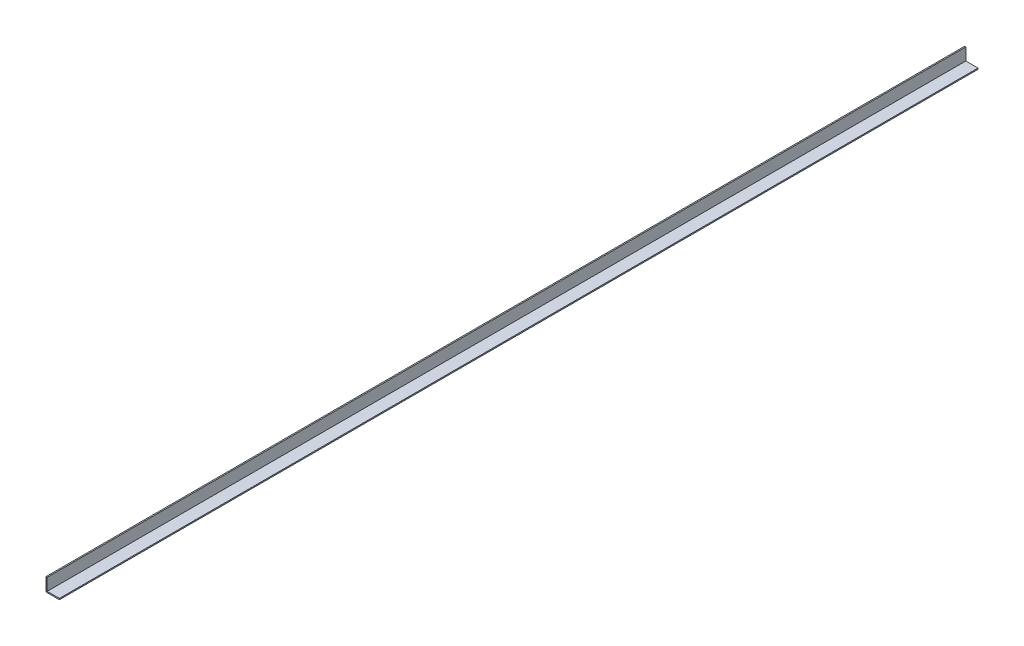
ISO-10303-21;
HEADER;
FILE_DESCRIPTION(('STEP AP214'),'2;1');
FILE_NAME('part.step','',(''),(''),'','','');
FILE_SCHEMA(('AUTOMOTIVE_DESIGN { 1 0 10303 214 1 1 1 1 }'));
ENDSEC;
DATA;
#1=APPLICATION_CONTEXT('core data for automotive mechanical design processes');
#2=APPLICATION_PROTOCOL_DEFINITION('international standard','automotive_design',2000,#1);
#3=PRODUCT_CONTEXT('',#1,'mechanical');
#4=PRODUCT('Part','Part','',(#3));
#5=PRODUCT_RELATED_PRODUCT_CATEGORY('part','',(#4));
#6=PRODUCT_DEFINITION_FORMATION('','',#4);
#7=PRODUCT_DEFINITION_CONTEXT('part definition',#1,'design');
#8=PRODUCT_DEFINITION('design','',#6,#7);
#9=PRODUCT_DEFINITION_SHAPE('','',#8);
#10=(LENGTH_UNIT() NAMED_UNIT(*) SI_UNIT(.MILLI.,.METRE.));
#11=(NAMED_UNIT(*) PLANE_ANGLE_UNIT() SI_UNIT($,.RADIAN.));
#12=(NAMED_UNIT(*) SI_UNIT($,.STERADIAN.) SOLID_ANGLE_UNIT());
#13=UNCERTAINTY_MEASURE_WITH_UNIT(LENGTH_MEASURE(1.E-05),#10,'distance_accuracy_value','');
#14=(GEOMETRIC_REPRESENTATION_CONTEXT(3) GLOBAL_UNCERTAINTY_ASSIGNED_CONTEXT((#13)) GLOBAL_UNIT_ASSIGNED_CONTEXT((#10,
#11,#12)) REPRESENTATION_CONTEXT('',''));
#15=CARTESIAN_POINT('',(0.,0.,0.));
#16=DIRECTION('',(0.,0.,1.));
#17=DIRECTION('',(1.,0.,0.));
#18=AXIS2_PLACEMENT_3D('',#15,#16,#17);
#19=CARTESIAN_POINT('',(7.94,88.9,-6100.));
#20=DIRECTION('',(0.,1.,0.));
#21=DIRECTION('',(0.,0.,1.));
#22=AXIS2_PLACEMENT_3D('',#19,#20,#21);
#23=PLANE('',#22);
#24=DIRECTION('',(-1.,0.,0.));
#25=VECTOR('',#24,1.);
#26=CARTESIAN_POINT('',(7.94,88.9,0.));
#27=LINE('',#26,#25);
#28=CARTESIAN_POINT('',(7.94,88.9,0.));
#29=VERTEX_POINT('',#28);
#30=CARTESIAN_POINT('',(0.,88.9,0.));
#31=VERTEX_POINT('',#30);
#32=EDGE_CURVE('E118',#29,#31,#27,.T.);
#33=ORIENTED_EDGE('',*,*,#32,.F.);
#34=DIRECTION('',(0.,0.,1.));
#35=VECTOR('',#34,1.);
#36=CARTESIAN_POINT('',(7.94,88.9,-6100.));
#37=LINE('',#36,#35);
#38=CARTESIAN_POINT('',(7.94,88.9,-6100.));
#39=VERTEX_POINT('',#38);
#40=EDGE_CURVE('E11',#39,#29,#37,.T.);
#41=ORIENTED_EDGE('',*,*,#40,.F.);
#42=DIRECTION('',(-1.,0.,0.));
#43=VECTOR('',#42,1.);
#44=CARTESIAN_POINT('',(7.94,88.9,-6100.));
#45=LINE('',#44,#43);
#46=CARTESIAN_POINT('',(0.,88.9,-6100.));
#47=VERTEX_POINT('',#46);
#48=EDGE_CURVE('E132',#39,#47,#45,.T.);
#49=ORIENTED_EDGE('',*,*,#48,.T.);
#50=DIRECTION('',(0.,0.,1.));
#51=VECTOR('',#50,1.);
#52=CARTESIAN_POINT('',(0.,88.9,-6100.));
#53=LINE('',#52,#51);
#54=EDGE_CURVE('E36',#47,#31,#53,.T.);
#55=ORIENTED_EDGE('',*,*,#54,.T.);
#56=EDGE_LOOP('',(#33,#41,#49,#55));
#57=FACE_BOUND('',#56,.T.);
#58=ADVANCED_FACE('F33',(#57),#23,.T.);
#59=CARTESIAN_POINT('',(7.94,7.94,-6100.));
#60=DIRECTION('',(1.,0.,0.));
#61=DIRECTION('',(0.,1.,0.));
#62=AXIS2_PLACEMENT_3D('',#59,#60,#61);
#63=PLANE('',#62);
#64=DIRECTION('',(0.,1.,0.));
#65=VECTOR('',#64,1.);
#66=CARTESIAN_POINT('',(7.94,7.94,0.));
#67=LINE('',#66,#65);
#68=CARTESIAN_POINT('',(7.94,7.94,0.));
#69=VERTEX_POINT('',#68);
#70=EDGE_CURVE('E130',#69,#29,#67,.T.);
#71=ORIENTED_EDGE('',*,*,#70,.F.);
#72=DIRECTION('',(0.,0.,1.));
#73=VECTOR('',#72,1.);
#74=CARTESIAN_POINT('',(7.94,7.94,-6100.));
#75=LINE('',#74,#73);
#76=CARTESIAN_POINT('',(7.94,7.94,-6100.));
#77=VERTEX_POINT('',#76);
#78=EDGE_CURVE('E42',#77,#69,#75,.T.);
#79=ORIENTED_EDGE('',*,*,#78,.F.);
#80=DIRECTION('',(0.,1.,0.));
#81=VECTOR('',#80,1.);
#82=CARTESIAN_POINT('',(7.94,7.94,-6100.));
#83=LINE('',#82,#81);
#84=EDGE_CURVE('E108',#77,#39,#83,.T.);
#85=ORIENTED_EDGE('',*,*,#84,.T.);
#86=ORIENTED_EDGE('',*,*,#40,.T.);
#87=EDGE_LOOP('',(#71,#79,#85,#86));
#88=FACE_BOUND('',#87,.T.);
#89=ADVANCED_FACE('F140',(#88),#63,.T.);
#90=CARTESIAN_POINT('',(88.9,7.94,-6100.));
#91=DIRECTION('',(0.,1.,0.));
#92=DIRECTION('',(-1.,0.,0.));
#93=AXIS2_PLACEMENT_3D('',#90,#91,#92);
#94=PLANE('',#93);
#95=DIRECTION('',(-1.,0.,0.));
#96=VECTOR('',#95,1.);
#97=CARTESIAN_POINT('',(88.9,7.94,0.));
#98=LINE('',#97,#96);
#99=CARTESIAN_POINT('',(88.9,7.94,0.));
#100=VERTEX_POINT('',#99);
#101=EDGE_CURVE('E95',#100,#69,#98,.T.);
#102=ORIENTED_EDGE('',*,*,#101,.F.);
#103=DIRECTION('',(0.,0.,1.));
#104=VECTOR('',#103,1.);
#105=CARTESIAN_POINT('',(88.9,7.94,-6100.));
#106=LINE('',#105,#104);
#107=CARTESIAN_POINT('',(88.9,7.94,-6100.));
#108=VERTEX_POINT('',#107);
#109=EDGE_CURVE('E90',#108,#100,#106,.T.);
#110=ORIENTED_EDGE('',*,*,#109,.F.);
#111=DIRECTION('',(-1.,0.,0.));
#112=VECTOR('',#111,1.);
#113=CARTESIAN_POINT('',(88.9,7.94,-6100.));
#114=LINE('',#113,#112);
#115=EDGE_CURVE('E93',#108,#77,#114,.T.);
#116=ORIENTED_EDGE('',*,*,#115,.T.);
#117=ORIENTED_EDGE('',*,*,#78,.T.);
#118=EDGE_LOOP('',(#102,#110,#116,#117));
#119=FACE_BOUND('',#118,.T.);
#120=ADVANCED_FACE('F92',(#119),#94,.T.);
#121=CARTESIAN_POINT('',(88.9,0.,-6100.));
#122=DIRECTION('',(1.,0.,0.));
#123=DIRECTION('',(0.,0.,-1.));
#124=AXIS2_PLACEMENT_3D('',#121,#122,#123);
#125=PLANE('',#124);
#126=DIRECTION('',(0.,1.,0.));
#127=VECTOR('',#126,1.);
#128=CARTESIAN_POINT('',(88.9,0.,0.));
#129=LINE('',#128,#127);
#130=CARTESIAN_POINT('',(88.9,0.,0.));
#131=VERTEX_POINT('',#130);
#132=EDGE_CURVE('E127',#131,#100,#129,.T.);
#133=ORIENTED_EDGE('',*,*,#132,.F.);
#134=DIRECTION('',(0.,0.,1.));
#135=VECTOR('',#134,1.);
#136=CARTESIAN_POINT('',(88.9,0.,-6100.));
#137=LINE('',#136,#135);
#138=CARTESIAN_POINT('',(88.9,0.,-6100.));
#139=VERTEX_POINT('',#138);
#140=EDGE_CURVE('E100',#139,#131,#137,.T.);
#141=ORIENTED_EDGE('',*,*,#140,.F.);
#142=DIRECTION('',(0.,1.,0.));
#143=VECTOR('',#142,1.);
#144=CARTESIAN_POINT('',(88.9,0.,-6100.));
#145=LINE('',#144,#143);
#146=EDGE_CURVE('E106',#139,#108,#145,.T.);
#147=ORIENTED_EDGE('',*,*,#146,.T.);
#148=ORIENTED_EDGE('',*,*,#109,.T.);
#149=EDGE_LOOP('',(#133,#141,#147,#148));
#150=FACE_BOUND('',#149,.T.);
#151=ADVANCED_FACE('F110',(#150),#125,.T.);
#152=CARTESIAN_POINT('',(0.,0.,-6100.));
#153=DIRECTION('',(0.,-1.,0.));
#154=DIRECTION('',(0.,0.,-1.));
#155=AXIS2_PLACEMENT_3D('',#152,#153,#154);
#156=PLANE('',#155);
#157=DIRECTION('',(1.,0.,0.));
#158=VECTOR('',#157,1.);
#159=CARTESIAN_POINT('',(0.,0.,0.));
#160=LINE('',#159,#158);
#161=CARTESIAN_POINT('',(0.,0.,0.));
#162=VERTEX_POINT('',#161);
#163=EDGE_CURVE('E124',#162,#131,#160,.T.);
#164=ORIENTED_EDGE('',*,*,#163,.F.);
#165=DIRECTION('',(0.,0.,1.));
#166=VECTOR('',#165,1.);
#167=CARTESIAN_POINT('',(0.,0.,-6100.));
#168=LINE('',#167,#166);
#169=CARTESIAN_POINT('',(0.,0.,-6100.));
#170=VERTEX_POINT('',#169);
#171=EDGE_CURVE('E135',#170,#162,#168,.T.);
#172=ORIENTED_EDGE('',*,*,#171,.F.);
#173=DIRECTION('',(1.,0.,0.));
#174=VECTOR('',#173,1.);
#175=CARTESIAN_POINT('',(0.,0.,-6100.));
#176=LINE('',#175,#174);
#177=EDGE_CURVE('E111',#170,#139,#176,.T.);
#178=ORIENTED_EDGE('',*,*,#177,.T.);
#179=ORIENTED_EDGE('',*,*,#140,.T.);
#180=EDGE_LOOP('',(#164,#172,#178,#179));
#181=FACE_BOUND('',#180,.T.);
#182=ADVANCED_FACE('F153',(#181),#156,.T.);
#183=CARTESIAN_POINT('',(0.,88.9,-6100.));
#184=DIRECTION('',(-1.,0.,0.));
#185=DIRECTION('',(0.,-1.,0.));
#186=AXIS2_PLACEMENT_3D('',#183,#184,#185);
#187=PLANE('',#186);
#188=DIRECTION('',(0.,-1.,0.));
#189=VECTOR('',#188,1.);
#190=CARTESIAN_POINT('',(0.,88.9,0.));
#191=LINE('',#190,#189);
#192=EDGE_CURVE('E121',#31,#162,#191,.T.);
#193=ORIENTED_EDGE('',*,*,#192,.F.);
#194=ORIENTED_EDGE('',*,*,#54,.F.);
#195=DIRECTION('',(0.,-1.,0.));
#196=VECTOR('',#195,1.);
#197=CARTESIAN_POINT('',(0.,88.9,-6100.));
#198=LINE('',#197,#196);
#199=EDGE_CURVE('E113',#47,#170,#198,.T.);
#200=ORIENTED_EDGE('',*,*,#199,.T.);
#201=ORIENTED_EDGE('',*,*,#171,.T.);
#202=EDGE_LOOP('',(#193,#194,#200,#201));
#203=FACE_BOUND('',#202,.T.);
#204=ADVANCED_FACE('F137',(#203),#187,.T.);
#205=CARTESIAN_POINT('',(0.,0.,-6100.));
#206=DIRECTION('',(0.,0.,1.));
#207=DIRECTION('',(1.,0.,0.));
#208=AXIS2_PLACEMENT_3D('',#205,#206,#207);
#209=PLANE('',#208);
#210=ORIENTED_EDGE('',*,*,#48,.F.);
#211=ORIENTED_EDGE('',*,*,#84,.F.);
#212=ORIENTED_EDGE('',*,*,#115,.F.);
#213=ORIENTED_EDGE('',*,*,#146,.F.);
#214=ORIENTED_EDGE('',*,*,#177,.F.);
#215=ORIENTED_EDGE('',*,*,#199,.F.);
#216=EDGE_LOOP('',(#210,#211,#212,#213,#214,#215));
#217=FACE_BOUND('',#216,.T.);
#218=ADVANCED_FACE('F104',(#217),#209,.F.);
#219=CARTESIAN_POINT('',(0.,0.,0.));
#220=DIRECTION('',(0.,0.,1.));
#221=DIRECTION('',(1.,0.,0.));
#222=AXIS2_PLACEMENT_3D('',#219,#220,#221);
#223=PLANE('',#222);
#224=ORIENTED_EDGE('',*,*,#32,.T.);
#225=ORIENTED_EDGE('',*,*,#192,.T.);
#226=ORIENTED_EDGE('',*,*,#163,.T.);
#227=ORIENTED_EDGE('',*,*,#132,.T.);
#228=ORIENTED_EDGE('',*,*,#101,.T.);
#229=ORIENTED_EDGE('',*,*,#70,.T.);
#230=EDGE_LOOP('',(#224,#225,#226,#227,#228,#229));
#231=FACE_BOUND('',#230,.T.);
#232=ADVANCED_FACE('F139',(#231),#223,.T.);
#233=CLOSED_SHELL('',(#58,#89,#120,#151,#182,#204,#218,#232));
#234=MANIFOLD_SOLID_BREP('B2',#233);
#235=ADVANCED_BREP_SHAPE_REPRESENTATION('',(#18,#234),#14);
#236=SHAPE_DEFINITION_REPRESENTATION(#9,#235);
ENDSEC;
END-ISO-10303-21;
